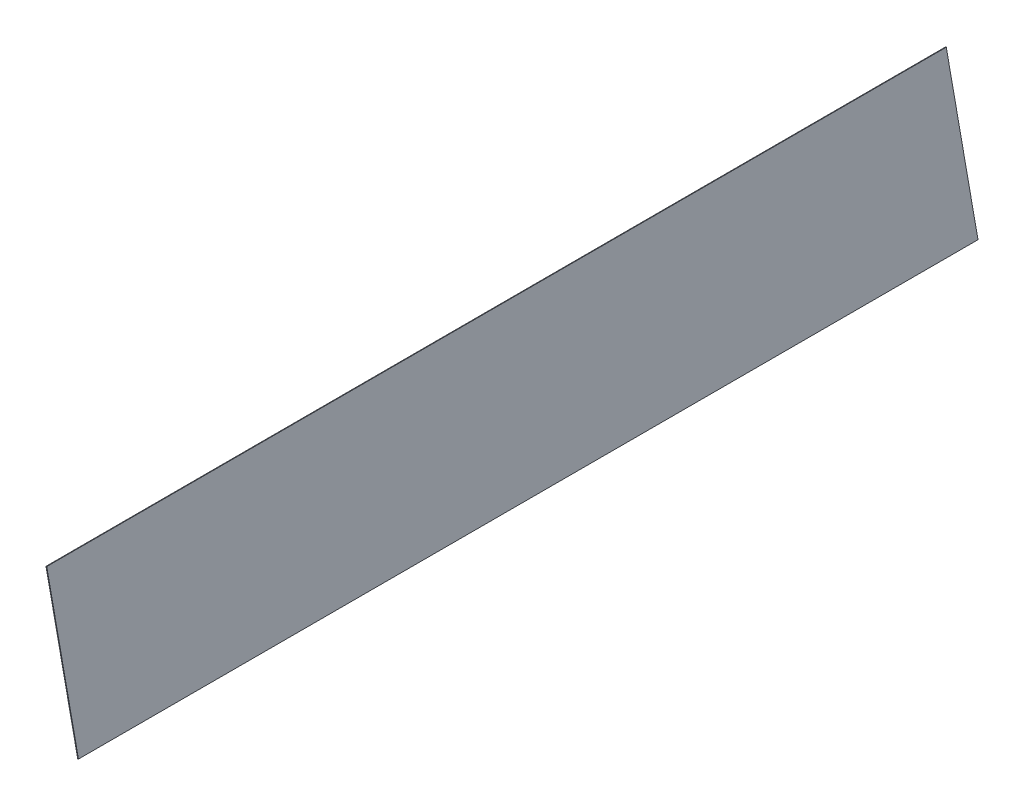
ISO-10303-21;
HEADER;
FILE_DESCRIPTION(('STEP AP214'),'2;1');
FILE_NAME('part.step','',(''),(''),'','','');
FILE_SCHEMA(('AUTOMOTIVE_DESIGN { 1 0 10303 214 1 1 1 1 }'));
ENDSEC;
DATA;
#1=APPLICATION_CONTEXT('core data for automotive mechanical design processes');
#2=APPLICATION_PROTOCOL_DEFINITION('international standard','automotive_design',2000,#1);
#3=PRODUCT_CONTEXT('',#1,'mechanical');
#4=PRODUCT('Part','Part','',(#3));
#5=PRODUCT_RELATED_PRODUCT_CATEGORY('part','',(#4));
#6=PRODUCT_DEFINITION_FORMATION('','',#4);
#7=PRODUCT_DEFINITION_CONTEXT('part definition',#1,'design');
#8=PRODUCT_DEFINITION('design','',#6,#7);
#9=PRODUCT_DEFINITION_SHAPE('','',#8);
#10=(LENGTH_UNIT() NAMED_UNIT(*) SI_UNIT(.MILLI.,.METRE.));
#11=(NAMED_UNIT(*) PLANE_ANGLE_UNIT() SI_UNIT($,.RADIAN.));
#12=(NAMED_UNIT(*) SI_UNIT($,.STERADIAN.) SOLID_ANGLE_UNIT());
#13=UNCERTAINTY_MEASURE_WITH_UNIT(LENGTH_MEASURE(1.E-05),#10,'distance_accuracy_value','');
#14=(GEOMETRIC_REPRESENTATION_CONTEXT(3) GLOBAL_UNCERTAINTY_ASSIGNED_CONTEXT((#13)) GLOBAL_UNIT_ASSIGNED_CONTEXT((#10,
#11,#12)) REPRESENTATION_CONTEXT('',''));
#15=CARTESIAN_POINT('',(0.,0.,0.));
#16=DIRECTION('',(0.,0.,1.));
#17=DIRECTION('',(1.,0.,0.));
#18=AXIS2_PLACEMENT_3D('',#15,#16,#17);
#19=CARTESIAN_POINT('',(43.62839930494,6.992136697285,-43.69));
#20=DIRECTION('',(0.978598276565702,0.205780011426372,0.));
#21=DIRECTION('',(0.,0.,1.));
#22=AXIS2_PLACEMENT_3D('',#19,#20,#21);
#23=PLANE('',#22);
#24=DIRECTION('',(0.,0.,-1.));
#25=VECTOR('',#24,1.);
#26=CARTESIAN_POINT('',(43.6530938940894,6.87470020663744,-30.95));
#27=LINE('',#26,#25);
#28=CARTESIAN_POINT('',(43.6530938940932,6.87470020663761,-18.7));
#29=VERTEX_POINT('',#28);
#30=CARTESIAN_POINT('',(43.6530938940919,6.87470020663759,-43.2));
#31=VERTEX_POINT('',#30);
#32=EDGE_CURVE('E21',#29,#31,#27,.T.);
#33=ORIENTED_EDGE('',*,*,#32,.F.);
#34=DIRECTION('',(-0.20578001142641,0.978598276565694,0.));
#35=VECTOR('',#34,1.);
#36=CARTESIAN_POINT('',(44.0852319180893,4.81964382585042,-18.7));
#37=LINE('',#36,#35);
#38=CARTESIAN_POINT('',(44.5173699420861,2.76458744506257,-18.7));
#39=VERTEX_POINT('',#38);
#40=EDGE_CURVE('E59',#39,#29,#37,.T.);
#41=ORIENTED_EDGE('',*,*,#40,.F.);
#42=DIRECTION('',(0.,0.,1.));
#43=VECTOR('',#42,1.);
#44=CARTESIAN_POINT('',(44.5173699420892,2.76458744506244,-30.95));
#45=LINE('',#44,#43);
#46=CARTESIAN_POINT('',(44.5173699420861,2.76458744506257,-43.2));
#47=VERTEX_POINT('',#46);
#48=EDGE_CURVE('E54',#47,#39,#45,.T.);
#49=ORIENTED_EDGE('',*,*,#48,.F.);
#50=DIRECTION('',(0.20578001142641,-0.978598276565694,0.));
#51=VECTOR('',#50,1.);
#52=CARTESIAN_POINT('',(44.0852319180893,4.81964382585042,-43.2));
#53=LINE('',#52,#51);
#54=EDGE_CURVE('E69',#31,#47,#53,.T.);
#55=ORIENTED_EDGE('',*,*,#54,.F.);
#56=EDGE_LOOP('',(#33,#41,#49,#55));
#57=FACE_BOUND('',#56,.T.);
#58=ADVANCED_FACE('F17',(#57),#23,.T.);
#59=CARTESIAN_POINT('',(43.63313048925,6.870502294405,-43.69));
#60=DIRECTION('',(-0.205780011420343,0.97859827656697,0.));
#61=DIRECTION('',(0.,0.,1.));
#62=AXIS2_PLACEMENT_3D('',#59,#60,#61);
#63=PLANE('',#62);
#64=DIRECTION('',(0.,0.,1.));
#65=VECTOR('',#64,1.);
#66=CARTESIAN_POINT('',(43.633521928555,6.87058460640952,-30.95));
#67=LINE('',#66,#65);
#68=CARTESIAN_POINT('',(43.633521928558,6.87058460640944,-43.2));
#69=VERTEX_POINT('',#68);
#70=CARTESIAN_POINT('',(43.633521928558,6.87058460640944,-18.7));
#71=VERTEX_POINT('',#70);
#72=EDGE_CURVE('E75',#69,#71,#67,.T.);
#73=ORIENTED_EDGE('',*,*,#72,.T.);
#74=DIRECTION('',(-0.978598276577051,-0.205780011372404,0.));
#75=VECTOR('',#74,1.);
#76=CARTESIAN_POINT('',(43.6433079113249,6.87264240652352,-18.7));
#77=LINE('',#76,#75);
#78=EDGE_CURVE('E64',#29,#71,#77,.T.);
#79=ORIENTED_EDGE('',*,*,#78,.F.);
#80=ORIENTED_EDGE('',*,*,#32,.T.);
#81=DIRECTION('',(0.978598276577051,0.205780011372404,0.));
#82=VECTOR('',#81,1.);
#83=CARTESIAN_POINT('',(43.6433079113249,6.87264240652352,-43.2));
#84=LINE('',#83,#82);
#85=EDGE_CURVE('E80',#69,#31,#84,.T.);
#86=ORIENTED_EDGE('',*,*,#85,.F.);
#87=EDGE_LOOP('',(#73,#79,#80,#86));
#88=FACE_BOUND('',#87,.T.);
#89=ADVANCED_FACE('F74',(#88),#63,.T.);
#90=CARTESIAN_POINT('',(43.60843590009,6.987938785052,-18.7));
#91=DIRECTION('',(0.,0.,1.));
#92=DIRECTION('',(0.205780011428524,-0.978598276565249,0.));
#93=AXIS2_PLACEMENT_3D('',#90,#91,#92);
#94=PLANE('',#93);
#95=ORIENTED_EDGE('',*,*,#40,.T.);
#96=ORIENTED_EDGE('',*,*,#78,.T.);
#97=DIRECTION('',(0.205780011428526,-0.978598276565249,0.));
#98=VECTOR('',#97,1.);
#99=CARTESIAN_POINT('',(44.065659952555,4.815528225622,-18.7));
#100=LINE('',#99,#98);
#101=CARTESIAN_POINT('',(44.4977979765542,2.76047184483429,-18.7));
#102=VERTEX_POINT('',#101);
#103=EDGE_CURVE('E85',#71,#102,#100,.T.);
#104=ORIENTED_EDGE('',*,*,#103,.T.);
#105=DIRECTION('',(-0.978598276587289,-0.205780011323712,0.));
#106=VECTOR('',#105,1.);
#107=CARTESIAN_POINT('',(44.50758395932,2.7625296449485,-18.7));
#108=LINE('',#107,#106);
#109=EDGE_CURVE('E66',#39,#102,#108,.T.);
#110=ORIENTED_EDGE('',*,*,#109,.F.);
#111=EDGE_LOOP('',(#95,#96,#104,#110));
#112=FACE_BOUND('',#111,.T.);
#113=ADVANCED_FACE('F61',(#112),#94,.T.);
#114=CARTESIAN_POINT('',(44.49740653724,2.76038953283,-18.21));
#115=DIRECTION('',(0.205780011323712,-0.978598276587289,0.));
#116=DIRECTION('',(0.,0.,-1.));
#117=AXIS2_PLACEMENT_3D('',#114,#115,#116);
#118=PLANE('',#117);
#119=ORIENTED_EDGE('',*,*,#48,.T.);
#120=ORIENTED_EDGE('',*,*,#109,.T.);
#121=DIRECTION('',(0.,0.,-1.));
#122=VECTOR('',#121,1.);
#123=CARTESIAN_POINT('',(44.497797976555,2.76047184483448,-30.95));
#124=LINE('',#123,#122);
#125=CARTESIAN_POINT('',(44.497797976553,2.76047184483441,-43.2));
#126=VERTEX_POINT('',#125);
#127=EDGE_CURVE('E27',#102,#126,#124,.T.);
#128=ORIENTED_EDGE('',*,*,#127,.T.);
#129=DIRECTION('',(-0.978598276557802,-0.205780011463941,0.));
#130=VECTOR('',#129,1.);
#131=CARTESIAN_POINT('',(44.5075839593201,2.76252964494848,-43.2));
#132=LINE('',#131,#130);
#133=EDGE_CURVE('E35',#47,#126,#132,.T.);
#134=ORIENTED_EDGE('',*,*,#133,.F.);
#135=EDGE_LOOP('',(#119,#120,#128,#134));
#136=FACE_BOUND('',#135,.T.);
#137=ADVANCED_FACE('F89',(#136),#118,.T.);
#138=CARTESIAN_POINT('',(44.5221011264,2.642953042182,-43.2));
#139=DIRECTION('',(0.,0.,-1.));
#140=DIRECTION('',(-0.205780011428524,0.978598276565249,0.));
#141=AXIS2_PLACEMENT_3D('',#138,#139,#140);
#142=PLANE('',#141);
#143=ORIENTED_EDGE('',*,*,#54,.T.);
#144=ORIENTED_EDGE('',*,*,#133,.T.);
#145=DIRECTION('',(-0.205780011428526,0.978598276565249,0.));
#146=VECTOR('',#145,1.);
#147=CARTESIAN_POINT('',(44.065659952555,4.815528225622,-43.2));
#148=LINE('',#147,#146);
#149=EDGE_CURVE('E11',#126,#69,#148,.T.);
#150=ORIENTED_EDGE('',*,*,#149,.T.);
#151=ORIENTED_EDGE('',*,*,#85,.T.);
#152=EDGE_LOOP('',(#143,#144,#150,#151));
#153=FACE_BOUND('',#152,.T.);
#154=ADVANCED_FACE('F91',(#153),#142,.T.);
#155=CARTESIAN_POINT('',(43.6088273394,6.988021097057,-43.69));
#156=DIRECTION('',(0.978598276565249,0.205780011428526,0.));
#157=DIRECTION('',(0.,0.,1.));
#158=AXIS2_PLACEMENT_3D('',#155,#156,#157);
#159=PLANE('',#158);
#160=ORIENTED_EDGE('',*,*,#127,.F.);
#161=ORIENTED_EDGE('',*,*,#103,.F.);
#162=ORIENTED_EDGE('',*,*,#72,.F.);
#163=ORIENTED_EDGE('',*,*,#149,.F.);
#164=EDGE_LOOP('',(#160,#161,#162,#163));
#165=FACE_BOUND('',#164,.T.);
#166=ADVANCED_FACE('F19',(#165),#159,.F.);
#167=CLOSED_SHELL('',(#58,#89,#113,#137,#154,#166));
#168=MANIFOLD_SOLID_BREP('B1',#167);
#169=ADVANCED_BREP_SHAPE_REPRESENTATION('',(#18,#168),#14);
#170=SHAPE_DEFINITION_REPRESENTATION(#9,#169);
ENDSEC;
END-ISO-10303-21;
